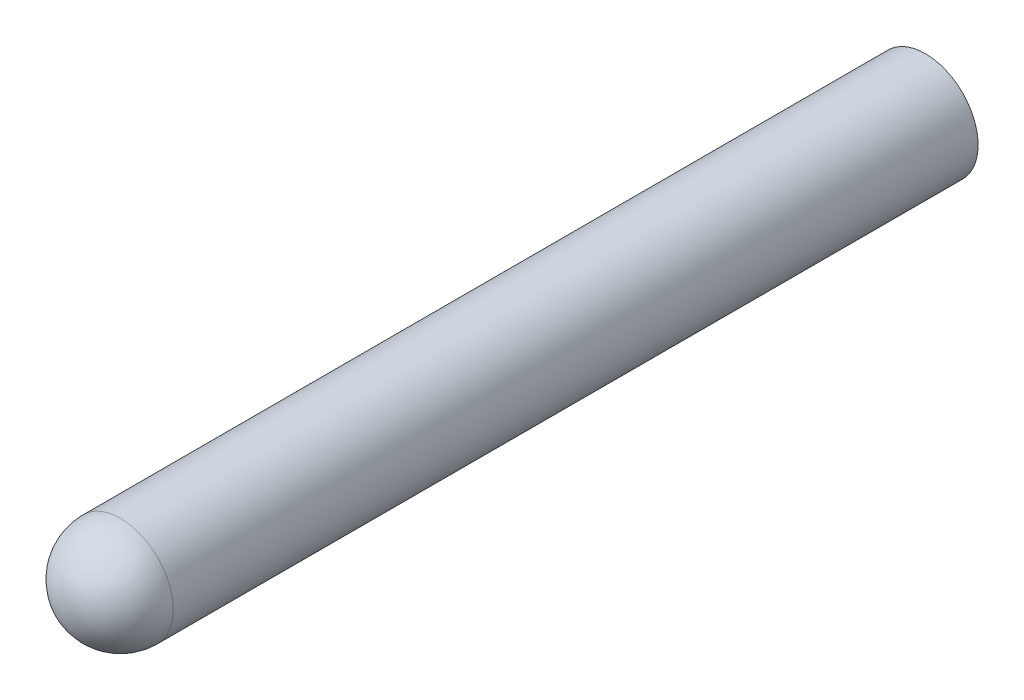
ISO-10303-21;
HEADER;
FILE_DESCRIPTION(('STEP AP214'),'2;1');
FILE_NAME('part.step','',(''),(''),'','','');
FILE_SCHEMA(('AUTOMOTIVE_DESIGN { 1 0 10303 214 1 1 1 1 }'));
ENDSEC;
DATA;
#1=APPLICATION_CONTEXT('core data for automotive mechanical design processes');
#2=APPLICATION_PROTOCOL_DEFINITION('international standard','automotive_design',2000,#1);
#3=PRODUCT_CONTEXT('',#1,'mechanical');
#4=PRODUCT('Part','Part','',(#3));
#5=PRODUCT_RELATED_PRODUCT_CATEGORY('part','',(#4));
#6=PRODUCT_DEFINITION_FORMATION('','',#4);
#7=PRODUCT_DEFINITION_CONTEXT('part definition',#1,'design');
#8=PRODUCT_DEFINITION('design','',#6,#7);
#9=PRODUCT_DEFINITION_SHAPE('','',#8);
#10=(LENGTH_UNIT() NAMED_UNIT(*) SI_UNIT(.MILLI.,.METRE.));
#11=(NAMED_UNIT(*) PLANE_ANGLE_UNIT() SI_UNIT($,.RADIAN.));
#12=(NAMED_UNIT(*) SI_UNIT($,.STERADIAN.) SOLID_ANGLE_UNIT());
#13=UNCERTAINTY_MEASURE_WITH_UNIT(LENGTH_MEASURE(1.E-05),#10,'distance_accuracy_value','');
#14=(GEOMETRIC_REPRESENTATION_CONTEXT(3) GLOBAL_UNCERTAINTY_ASSIGNED_CONTEXT((#13)) GLOBAL_UNIT_ASSIGNED_CONTEXT((#10,
#11,#12)) REPRESENTATION_CONTEXT('',''));
#15=CARTESIAN_POINT('',(0.,0.,0.));
#16=DIRECTION('',(0.,0.,1.));
#17=DIRECTION('',(1.,0.,0.));
#18=AXIS2_PLACEMENT_3D('',#15,#16,#17);
#19=CARTESIAN_POINT('',(6.15,0.,-74.85));
#20=DIRECTION('',(0.,0.,1.));
#21=DIRECTION('',(1.,0.,0.));
#22=AXIS2_PLACEMENT_3D('',#19,#20,#21);
#23=PLANE('',#22);
#24=CARTESIAN_POINT('',(0.,0.,-74.85));
#25=DIRECTION('',(0.,0.,-1.));
#26=DIRECTION('',(-1.,0.,0.));
#27=AXIS2_PLACEMENT_3D('',#24,#25,#26);
#28=CIRCLE('',#27,5.3);
#29=CARTESIAN_POINT('',(-5.3,0.,-74.85));
#30=VERTEX_POINT('',#29);
#31=EDGE_CURVE('E10',#30,#30,#28,.T.);
#32=ORIENTED_EDGE('',*,*,#31,.F.);
#33=EDGE_LOOP('',(#32));
#34=FACE_BOUND('',#33,.T.);
#35=CARTESIAN_POINT('',(0.,0.,-74.85));
#36=DIRECTION('',(0.,0.,-1.));
#37=DIRECTION('',(-1.,0.,0.));
#38=AXIS2_PLACEMENT_3D('',#35,#36,#37);
#39=CIRCLE('',#38,6.15);
#40=CARTESIAN_POINT('',(-6.15,0.,-74.85));
#41=VERTEX_POINT('',#40);
#42=EDGE_CURVE('E44',#41,#41,#39,.T.);
#43=ORIENTED_EDGE('',*,*,#42,.T.);
#44=EDGE_LOOP('',(#43));
#45=FACE_BOUND('',#44,.T.);
#46=ADVANCED_FACE('F30',(#34,#45),#23,.F.);
#47=CARTESIAN_POINT('',(0.,0.,25.4498229011049));
#48=DIRECTION('',(0.,0.,-1.));
#49=DIRECTION('',(-1.,0.,0.));
#50=AXIS2_PLACEMENT_3D('',#47,#48,#49);
#51=CYLINDRICAL_SURFACE('',#50,5.3);
#52=CARTESIAN_POINT('',(0.,0.,19.));
#53=DIRECTION('',(0.,0.,-1.));
#54=DIRECTION('',(-1.,0.,0.));
#55=AXIS2_PLACEMENT_3D('',#52,#53,#54);
#56=CIRCLE('',#55,5.3);
#57=CARTESIAN_POINT('',(-5.3,0.,19.));
#58=VERTEX_POINT('',#57);
#59=EDGE_CURVE('E36',#58,#58,#56,.T.);
#60=ORIENTED_EDGE('',*,*,#59,.F.);
#61=EDGE_LOOP('',(#60));
#62=FACE_BOUND('',#61,.T.);
#63=ORIENTED_EDGE('',*,*,#31,.T.);
#64=EDGE_LOOP('',(#63));
#65=FACE_BOUND('',#64,.T.);
#66=ADVANCED_FACE('F64',(#62,#65),#51,.F.);
#67=CARTESIAN_POINT('',(0.,0.,19.));
#68=DIRECTION('',(0.,0.,-1.));
#69=DIRECTION('',(1.,0.,0.));
#70=AXIS2_PLACEMENT_3D('',#67,#68,#69);
#71=SPHERICAL_SURFACE('',#70,5.3);
#72=ORIENTED_EDGE('',*,*,#59,.T.);
#73=EDGE_LOOP('',(#72));
#74=FACE_BOUND('',#73,.T.);
#75=ADVANCED_FACE('F59',(#74),#71,.F.);
#76=CARTESIAN_POINT('',(0.,0.,19.));
#77=DIRECTION('',(0.,0.,-1.));
#78=DIRECTION('',(1.,0.,0.));
#79=AXIS2_PLACEMENT_3D('',#76,#77,#78);
#80=SPHERICAL_SURFACE('',#79,6.15);
#81=CARTESIAN_POINT('',(0.,0.,19.));
#82=DIRECTION('',(0.,0.,-1.));
#83=DIRECTION('',(-1.,0.,0.));
#84=AXIS2_PLACEMENT_3D('',#81,#82,#83);
#85=CIRCLE('',#84,6.15);
#86=CARTESIAN_POINT('',(-6.15,0.,19.));
#87=VERTEX_POINT('',#86);
#88=EDGE_CURVE('E40',#87,#87,#85,.T.);
#89=ORIENTED_EDGE('',*,*,#88,.F.);
#90=EDGE_LOOP('',(#89));
#91=FACE_BOUND('',#90,.T.);
#92=ADVANCED_FACE('F54',(#91),#80,.T.);
#93=CARTESIAN_POINT('',(0.,0.,25.4498229011049));
#94=DIRECTION('',(0.,0.,-1.));
#95=DIRECTION('',(-1.,0.,0.));
#96=AXIS2_PLACEMENT_3D('',#93,#94,#95);
#97=CYLINDRICAL_SURFACE('',#96,6.15);
#98=ORIENTED_EDGE('',*,*,#42,.F.);
#99=EDGE_LOOP('',(#98));
#100=FACE_BOUND('',#99,.T.);
#101=ORIENTED_EDGE('',*,*,#88,.T.);
#102=EDGE_LOOP('',(#101));
#103=FACE_BOUND('',#102,.T.);
#104=ADVANCED_FACE('F51',(#100,#103),#97,.T.);
#105=CLOSED_SHELL('',(#46,#66,#75,#92,#104));
#106=MANIFOLD_SOLID_BREP('B2',#105);
#107=ADVANCED_BREP_SHAPE_REPRESENTATION('',(#18,#106),#14);
#108=SHAPE_DEFINITION_REPRESENTATION(#9,#107);
ENDSEC;
END-ISO-10303-21;
